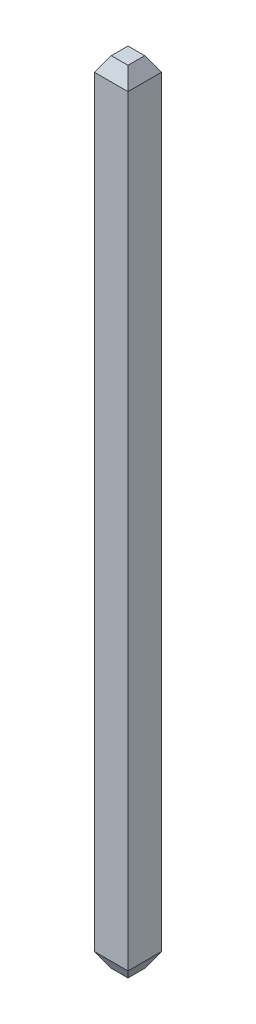
ISO-10303-21;
HEADER;
FILE_DESCRIPTION(('STEP AP214'),'2;1');
FILE_NAME('part.step','',(''),(''),'','','');
FILE_SCHEMA(('AUTOMOTIVE_DESIGN { 1 0 10303 214 1 1 1 1 }'));
ENDSEC;
DATA;
#1=APPLICATION_CONTEXT('core data for automotive mechanical design processes');
#2=APPLICATION_PROTOCOL_DEFINITION('international standard','automotive_design',2000,#1);
#3=PRODUCT_CONTEXT('',#1,'mechanical');
#4=PRODUCT('Part','Part','',(#3));
#5=PRODUCT_RELATED_PRODUCT_CATEGORY('part','',(#4));
#6=PRODUCT_DEFINITION_FORMATION('','',#4);
#7=PRODUCT_DEFINITION_CONTEXT('part definition',#1,'design');
#8=PRODUCT_DEFINITION('design','',#6,#7);
#9=PRODUCT_DEFINITION_SHAPE('','',#8);
#10=(LENGTH_UNIT() NAMED_UNIT(*) SI_UNIT(.MILLI.,.METRE.));
#11=(NAMED_UNIT(*) PLANE_ANGLE_UNIT() SI_UNIT($,.RADIAN.));
#12=(NAMED_UNIT(*) SI_UNIT($,.STERADIAN.) SOLID_ANGLE_UNIT());
#13=UNCERTAINTY_MEASURE_WITH_UNIT(LENGTH_MEASURE(1.E-05),#10,'distance_accuracy_value','');
#14=(GEOMETRIC_REPRESENTATION_CONTEXT(3) GLOBAL_UNCERTAINTY_ASSIGNED_CONTEXT((#13)) GLOBAL_UNIT_ASSIGNED_CONTEXT((#10,
#11,#12)) REPRESENTATION_CONTEXT('',''));
#15=CARTESIAN_POINT('',(0.,0.,0.));
#16=DIRECTION('',(0.,0.,1.));
#17=DIRECTION('',(1.,0.,0.));
#18=AXIS2_PLACEMENT_3D('',#15,#16,#17);
#19=CARTESIAN_POINT('',(-0.3,0.25980762113533,-0.3));
#20=DIRECTION('',(0.866025403784437,0.500000000000003,0.));
#21=DIRECTION('',(-0.500000000000003,0.866025403784437,0.));
#22=AXIS2_PLACEMENT_3D('',#19,#20,#21);
#23=PLANE('',#22);
#24=DIRECTION('',(0.,0.,-1.));
#25=VECTOR('',#24,1.);
#26=CARTESIAN_POINT('',(-0.3,0.25980762113533,-0.3));
#27=LINE('',#26,#25);
#28=CARTESIAN_POINT('',(-0.3,0.25980762113533,0.3));
#29=VERTEX_POINT('',#28);
#30=CARTESIAN_POINT('',(-0.3,0.25980762113533,-0.3));
#31=VERTEX_POINT('',#30);
#32=EDGE_CURVE('E119',#29,#31,#27,.T.);
#33=ORIENTED_EDGE('',*,*,#32,.T.);
#34=DIRECTION('',(0.44721359549996,-0.774596669241481,0.44721359549996));
#35=VECTOR('',#34,1.);
#36=CARTESIAN_POINT('',(-0.3,0.25980762113533,-0.3));
#37=LINE('',#36,#35);
#38=CARTESIAN_POINT('',(-0.15,0.,-0.15));
#39=VERTEX_POINT('',#38);
#40=EDGE_CURVE('E90',#31,#39,#37,.T.);
#41=ORIENTED_EDGE('',*,*,#40,.T.);
#42=DIRECTION('',(0.,0.,1.));
#43=VECTOR('',#42,1.);
#44=CARTESIAN_POINT('',(-0.15,0.,0.));
#45=LINE('',#44,#43);
#46=CARTESIAN_POINT('',(-0.15,0.,0.15));
#47=VERTEX_POINT('',#46);
#48=EDGE_CURVE('E20',#39,#47,#45,.T.);
#49=ORIENTED_EDGE('',*,*,#48,.T.);
#50=DIRECTION('',(-0.44721359549996,0.774596669241481,0.44721359549996));
#51=VECTOR('',#50,1.);
#52=CARTESIAN_POINT('',(-0.15,0.,0.15));
#53=LINE('',#52,#51);
#54=EDGE_CURVE('E88',#47,#29,#53,.T.);
#55=ORIENTED_EDGE('',*,*,#54,.T.);
#56=EDGE_LOOP('',(#33,#41,#49,#55));
#57=FACE_BOUND('',#56,.T.);
#58=ADVANCED_FACE('F17',(#57),#23,.F.);
#59=CARTESIAN_POINT('',(-0.15,14.2,0.));
#60=DIRECTION('',(-0.866025403784439,0.5,0.));
#61=DIRECTION('',(-0.5,-0.866025403784439,0.));
#62=AXIS2_PLACEMENT_3D('',#59,#60,#61);
#63=PLANE('',#62);
#64=DIRECTION('',(-0.447213595499958,-0.774596669241483,0.447213595499958));
#65=VECTOR('',#64,1.);
#66=CARTESIAN_POINT('',(-0.15,14.2,0.15));
#67=LINE('',#66,#65);
#68=CARTESIAN_POINT('',(-0.15,14.2,0.15));
#69=VERTEX_POINT('',#68);
#70=CARTESIAN_POINT('',(-0.3,13.9401923788647,0.3));
#71=VERTEX_POINT('',#70);
#72=EDGE_CURVE('E108',#69,#71,#67,.T.);
#73=ORIENTED_EDGE('',*,*,#72,.F.);
#74=DIRECTION('',(0.,0.,1.));
#75=VECTOR('',#74,1.);
#76=CARTESIAN_POINT('',(-0.15,14.2,0.));
#77=LINE('',#76,#75);
#78=CARTESIAN_POINT('',(-0.15,14.2,-0.15));
#79=VERTEX_POINT('',#78);
#80=EDGE_CURVE('E80',#79,#69,#77,.T.);
#81=ORIENTED_EDGE('',*,*,#80,.F.);
#82=DIRECTION('',(0.447213595499958,0.774596669241483,0.447213595499958));
#83=VECTOR('',#82,1.);
#84=CARTESIAN_POINT('',(-0.3,13.9401923788647,-0.3));
#85=LINE('',#84,#83);
#86=CARTESIAN_POINT('',(-0.3,13.9401923788647,-0.3));
#87=VERTEX_POINT('',#86);
#88=EDGE_CURVE('E115',#87,#79,#85,.T.);
#89=ORIENTED_EDGE('',*,*,#88,.F.);
#90=DIRECTION('',(0.,0.,-1.));
#91=VECTOR('',#90,1.);
#92=CARTESIAN_POINT('',(-0.3,13.9401923788647,-0.3));
#93=LINE('',#92,#91);
#94=EDGE_CURVE('E121',#87,#71,#93,.F.);
#95=ORIENTED_EDGE('',*,*,#94,.T.);
#96=EDGE_LOOP('',(#73,#81,#89,#95));
#97=FACE_BOUND('',#96,.T.);
#98=ADVANCED_FACE('F211',(#97),#63,.T.);
#99=CARTESIAN_POINT('',(0.,0.,0.));
#100=DIRECTION('',(0.,1.,0.));
#101=DIRECTION('',(0.,0.,1.));
#102=AXIS2_PLACEMENT_3D('',#99,#100,#101);
#103=PLANE('',#102);
#104=DIRECTION('',(1.,0.,0.));
#105=VECTOR('',#104,1.);
#106=CARTESIAN_POINT('',(-0.3,0.,-0.15));
#107=LINE('',#106,#105);
#108=CARTESIAN_POINT('',(0.15,0.,-0.15));
#109=VERTEX_POINT('',#108);
#110=EDGE_CURVE('E113',#39,#109,#107,.T.);
#111=ORIENTED_EDGE('',*,*,#110,.T.);
#112=DIRECTION('',(0.,0.,1.));
#113=VECTOR('',#112,1.);
#114=CARTESIAN_POINT('',(0.15,0.,-0.3));
#115=LINE('',#114,#113);
#116=CARTESIAN_POINT('',(0.15,0.,0.15));
#117=VERTEX_POINT('',#116);
#118=EDGE_CURVE('E105',#109,#117,#115,.T.);
#119=ORIENTED_EDGE('',*,*,#118,.T.);
#120=DIRECTION('',(1.,0.,0.));
#121=VECTOR('',#120,1.);
#122=CARTESIAN_POINT('',(-0.3,0.,0.15));
#123=LINE('',#122,#121);
#124=EDGE_CURVE('E94',#117,#47,#123,.F.);
#125=ORIENTED_EDGE('',*,*,#124,.T.);
#126=ORIENTED_EDGE('',*,*,#48,.F.);
#127=EDGE_LOOP('',(#111,#119,#125,#126));
#128=FACE_BOUND('',#127,.T.);
#129=ADVANCED_FACE('F103',(#128),#103,.F.);
#130=CARTESIAN_POINT('',(-0.3,0.25980762113533,0.3));
#131=DIRECTION('',(0.,0.500000000000003,-0.866025403784437));
#132=DIRECTION('',(0.,0.866025403784437,0.500000000000003));
#133=AXIS2_PLACEMENT_3D('',#130,#131,#132);
#134=PLANE('',#133);
#135=ORIENTED_EDGE('',*,*,#124,.F.);
#136=DIRECTION('',(0.44721359549996,0.774596669241481,0.44721359549996));
#137=VECTOR('',#136,1.);
#138=CARTESIAN_POINT('',(0.15,0.,0.15));
#139=LINE('',#138,#137);
#140=CARTESIAN_POINT('',(0.3,0.25980762113533,0.3));
#141=VERTEX_POINT('',#140);
#142=EDGE_CURVE('E128',#117,#141,#139,.T.);
#143=ORIENTED_EDGE('',*,*,#142,.T.);
#144=DIRECTION('',(-1.,0.,0.));
#145=VECTOR('',#144,1.);
#146=CARTESIAN_POINT('',(-0.3,0.25980762113533,0.3));
#147=LINE('',#146,#145);
#148=EDGE_CURVE('E100',#141,#29,#147,.T.);
#149=ORIENTED_EDGE('',*,*,#148,.T.);
#150=ORIENTED_EDGE('',*,*,#54,.F.);
#151=EDGE_LOOP('',(#135,#143,#149,#150));
#152=FACE_BOUND('',#151,.T.);
#153=ADVANCED_FACE('F97',(#152),#134,.F.);
#154=CARTESIAN_POINT('',(0.,14.2,0.));
#155=DIRECTION('',(0.,1.,0.));
#156=DIRECTION('',(0.,0.,1.));
#157=AXIS2_PLACEMENT_3D('',#154,#155,#156);
#158=PLANE('',#157);
#159=DIRECTION('',(0.,0.,1.));
#160=VECTOR('',#159,1.);
#161=CARTESIAN_POINT('',(0.15,14.2,0.));
#162=LINE('',#161,#160);
#163=CARTESIAN_POINT('',(0.15,14.2,-0.15));
#164=VERTEX_POINT('',#163);
#165=CARTESIAN_POINT('',(0.15,14.2,0.15));
#166=VERTEX_POINT('',#165);
#167=EDGE_CURVE('E140',#164,#166,#162,.T.);
#168=ORIENTED_EDGE('',*,*,#167,.F.);
#169=DIRECTION('',(1.,0.,0.));
#170=VECTOR('',#169,1.);
#171=CARTESIAN_POINT('',(0.,14.2,-0.15));
#172=LINE('',#171,#170);
#173=EDGE_CURVE('E117',#79,#164,#172,.T.);
#174=ORIENTED_EDGE('',*,*,#173,.F.);
#175=ORIENTED_EDGE('',*,*,#80,.T.);
#176=DIRECTION('',(1.,0.,0.));
#177=VECTOR('',#176,1.);
#178=CARTESIAN_POINT('',(0.,14.2,0.15));
#179=LINE('',#178,#177);
#180=EDGE_CURVE('E110',#166,#69,#179,.F.);
#181=ORIENTED_EDGE('',*,*,#180,.F.);
#182=EDGE_LOOP('',(#168,#174,#175,#181));
#183=FACE_BOUND('',#182,.T.);
#184=ADVANCED_FACE('F204',(#183),#158,.T.);
#185=CARTESIAN_POINT('',(0.,14.2,0.15));
#186=DIRECTION('',(0.,0.5,0.866025403784439));
#187=DIRECTION('',(0.,-0.866025403784439,0.5));
#188=AXIS2_PLACEMENT_3D('',#185,#186,#187);
#189=PLANE('',#188);
#190=DIRECTION('',(0.447213595499958,-0.774596669241483,0.447213595499958));
#191=VECTOR('',#190,1.);
#192=CARTESIAN_POINT('',(0.15,14.2,0.15));
#193=LINE('',#192,#191);
#194=CARTESIAN_POINT('',(0.3,13.9401923788647,0.3));
#195=VERTEX_POINT('',#194);
#196=EDGE_CURVE('E142',#166,#195,#193,.T.);
#197=ORIENTED_EDGE('',*,*,#196,.F.);
#198=ORIENTED_EDGE('',*,*,#180,.T.);
#199=ORIENTED_EDGE('',*,*,#72,.T.);
#200=DIRECTION('',(-1.,0.,0.));
#201=VECTOR('',#200,1.);
#202=CARTESIAN_POINT('',(-0.3,13.9401923788647,0.3));
#203=LINE('',#202,#201);
#204=EDGE_CURVE('E134',#71,#195,#203,.F.);
#205=ORIENTED_EDGE('',*,*,#204,.T.);
#206=EDGE_LOOP('',(#197,#198,#199,#205));
#207=FACE_BOUND('',#206,.T.);
#208=ADVANCED_FACE('F201',(#207),#189,.T.);
#209=CARTESIAN_POINT('',(-0.3,0.25980762113533,-0.3));
#210=DIRECTION('',(0.,0.500000000000003,0.866025403784437));
#211=DIRECTION('',(0.,-0.866025403784437,0.500000000000003));
#212=AXIS2_PLACEMENT_3D('',#209,#210,#211);
#213=PLANE('',#212);
#214=ORIENTED_EDGE('',*,*,#110,.F.);
#215=ORIENTED_EDGE('',*,*,#40,.F.);
#216=DIRECTION('',(1.,0.,0.));
#217=VECTOR('',#216,1.);
#218=CARTESIAN_POINT('',(-0.3,0.25980762113533,-0.3));
#219=LINE('',#218,#217);
#220=CARTESIAN_POINT('',(0.3,0.25980762113533,-0.3));
#221=VERTEX_POINT('',#220);
#222=EDGE_CURVE('E144',#31,#221,#219,.T.);
#223=ORIENTED_EDGE('',*,*,#222,.T.);
#224=DIRECTION('',(-0.44721359549996,-0.774596669241481,0.44721359549996));
#225=VECTOR('',#224,1.);
#226=CARTESIAN_POINT('',(0.3,0.25980762113533,-0.3));
#227=LINE('',#226,#225);
#228=EDGE_CURVE('E124',#221,#109,#227,.T.);
#229=ORIENTED_EDGE('',*,*,#228,.T.);
#230=EDGE_LOOP('',(#214,#215,#223,#229));
#231=FACE_BOUND('',#230,.T.);
#232=ADVANCED_FACE('F175',(#231),#213,.F.);
#233=CARTESIAN_POINT('',(0.,14.2,-0.15));
#234=DIRECTION('',(0.,0.5,-0.866025403784439));
#235=DIRECTION('',(0.,0.866025403784439,0.5));
#236=AXIS2_PLACEMENT_3D('',#233,#234,#235);
#237=PLANE('',#236);
#238=ORIENTED_EDGE('',*,*,#88,.T.);
#239=ORIENTED_EDGE('',*,*,#173,.T.);
#240=DIRECTION('',(-0.447213595499958,0.774596669241483,0.447213595499958));
#241=VECTOR('',#240,1.);
#242=CARTESIAN_POINT('',(0.3,13.9401923788647,-0.3));
#243=LINE('',#242,#241);
#244=CARTESIAN_POINT('',(0.3,13.9401923788647,-0.3));
#245=VERTEX_POINT('',#244);
#246=EDGE_CURVE('E137',#245,#164,#243,.T.);
#247=ORIENTED_EDGE('',*,*,#246,.F.);
#248=DIRECTION('',(1.,0.,0.));
#249=VECTOR('',#248,1.);
#250=CARTESIAN_POINT('',(-0.3,13.9401923788647,-0.3));
#251=LINE('',#250,#249);
#252=EDGE_CURVE('E34',#245,#87,#251,.F.);
#253=ORIENTED_EDGE('',*,*,#252,.T.);
#254=EDGE_LOOP('',(#238,#239,#247,#253));
#255=FACE_BOUND('',#254,.T.);
#256=ADVANCED_FACE('F194',(#255),#237,.T.);
#257=CARTESIAN_POINT('',(-0.3,14.2,-0.3));
#258=DIRECTION('',(1.,0.,0.));
#259=DIRECTION('',(0.,0.,-1.));
#260=AXIS2_PLACEMENT_3D('',#257,#258,#259);
#261=PLANE('',#260);
#262=ORIENTED_EDGE('',*,*,#94,.F.);
#263=DIRECTION('',(0.,1.,0.));
#264=VECTOR('',#263,1.);
#265=CARTESIAN_POINT('',(-0.3,14.2,-0.3));
#266=LINE('',#265,#264);
#267=EDGE_CURVE('E148',#87,#31,#266,.F.);
#268=ORIENTED_EDGE('',*,*,#267,.T.);
#269=ORIENTED_EDGE('',*,*,#32,.F.);
#270=DIRECTION('',(0.,1.,0.));
#271=VECTOR('',#270,1.);
#272=CARTESIAN_POINT('',(-0.3,14.2,0.3));
#273=LINE('',#272,#271);
#274=EDGE_CURVE('E131',#29,#71,#273,.T.);
#275=ORIENTED_EDGE('',*,*,#274,.T.);
#276=EDGE_LOOP('',(#262,#268,#269,#275));
#277=FACE_BOUND('',#276,.T.);
#278=ADVANCED_FACE('F191',(#277),#261,.F.);
#279=CARTESIAN_POINT('',(0.3,0.25980762113533,-0.3));
#280=DIRECTION('',(-0.866025403784437,0.500000000000003,0.));
#281=DIRECTION('',(-0.500000000000003,-0.866025403784437,0.));
#282=AXIS2_PLACEMENT_3D('',#279,#280,#281);
#283=PLANE('',#282);
#284=ORIENTED_EDGE('',*,*,#118,.F.);
#285=ORIENTED_EDGE('',*,*,#228,.F.);
#286=DIRECTION('',(0.,0.,1.));
#287=VECTOR('',#286,1.);
#288=CARTESIAN_POINT('',(0.3,0.25980762113533,-0.3));
#289=LINE('',#288,#287);
#290=EDGE_CURVE('E151',#221,#141,#289,.T.);
#291=ORIENTED_EDGE('',*,*,#290,.T.);
#292=ORIENTED_EDGE('',*,*,#142,.F.);
#293=EDGE_LOOP('',(#284,#285,#291,#292));
#294=FACE_BOUND('',#293,.T.);
#295=ADVANCED_FACE('F172',(#294),#283,.F.);
#296=CARTESIAN_POINT('',(-0.3,14.2,0.3));
#297=DIRECTION('',(0.,0.,-1.));
#298=DIRECTION('',(-1.,0.,0.));
#299=AXIS2_PLACEMENT_3D('',#296,#297,#298);
#300=PLANE('',#299);
#301=ORIENTED_EDGE('',*,*,#204,.F.);
#302=ORIENTED_EDGE('',*,*,#274,.F.);
#303=ORIENTED_EDGE('',*,*,#148,.F.);
#304=DIRECTION('',(0.,1.,0.));
#305=VECTOR('',#304,1.);
#306=CARTESIAN_POINT('',(0.3,14.2,0.3));
#307=LINE('',#306,#305);
#308=EDGE_CURVE('E154',#141,#195,#307,.T.);
#309=ORIENTED_EDGE('',*,*,#308,.T.);
#310=EDGE_LOOP('',(#301,#302,#303,#309));
#311=FACE_BOUND('',#310,.T.);
#312=ADVANCED_FACE('F170',(#311),#300,.F.);
#313=CARTESIAN_POINT('',(0.15,14.2,0.));
#314=DIRECTION('',(0.866025403784439,0.5,0.));
#315=DIRECTION('',(-0.5,0.866025403784439,0.));
#316=AXIS2_PLACEMENT_3D('',#313,#314,#315);
#317=PLANE('',#316);
#318=ORIENTED_EDGE('',*,*,#196,.T.);
#319=DIRECTION('',(0.,0.,1.));
#320=VECTOR('',#319,1.);
#321=CARTESIAN_POINT('',(0.3,13.9401923788647,-0.3));
#322=LINE('',#321,#320);
#323=EDGE_CURVE('E26',#195,#245,#322,.F.);
#324=ORIENTED_EDGE('',*,*,#323,.T.);
#325=ORIENTED_EDGE('',*,*,#246,.T.);
#326=ORIENTED_EDGE('',*,*,#167,.T.);
#327=EDGE_LOOP('',(#318,#324,#325,#326));
#328=FACE_BOUND('',#327,.T.);
#329=ADVANCED_FACE('F160',(#328),#317,.T.);
#330=CARTESIAN_POINT('',(-0.3,14.2,-0.3));
#331=DIRECTION('',(0.,0.,1.));
#332=DIRECTION('',(1.,0.,0.));
#333=AXIS2_PLACEMENT_3D('',#330,#331,#332);
#334=PLANE('',#333);
#335=ORIENTED_EDGE('',*,*,#252,.F.);
#336=DIRECTION('',(0.,1.,0.));
#337=VECTOR('',#336,1.);
#338=CARTESIAN_POINT('',(0.3,14.2,-0.3));
#339=LINE('',#338,#337);
#340=EDGE_CURVE('E11',#245,#221,#339,.F.);
#341=ORIENTED_EDGE('',*,*,#340,.T.);
#342=ORIENTED_EDGE('',*,*,#222,.F.);
#343=ORIENTED_EDGE('',*,*,#267,.F.);
#344=EDGE_LOOP('',(#335,#341,#342,#343));
#345=FACE_BOUND('',#344,.T.);
#346=ADVANCED_FACE('F176',(#345),#334,.F.);
#347=CARTESIAN_POINT('',(0.3,14.2,-0.3));
#348=DIRECTION('',(-1.,0.,0.));
#349=DIRECTION('',(0.,0.,1.));
#350=AXIS2_PLACEMENT_3D('',#347,#348,#349);
#351=PLANE('',#350);
#352=ORIENTED_EDGE('',*,*,#323,.F.);
#353=ORIENTED_EDGE('',*,*,#308,.F.);
#354=ORIENTED_EDGE('',*,*,#290,.F.);
#355=ORIENTED_EDGE('',*,*,#340,.F.);
#356=EDGE_LOOP('',(#352,#353,#354,#355));
#357=FACE_BOUND('',#356,.T.);
#358=ADVANCED_FACE('F166',(#357),#351,.F.);
#359=CLOSED_SHELL('',(#58,#98,#129,#153,#184,#208,#232,#256,#278,#295,#312,#329,#346,#358));
#360=MANIFOLD_SOLID_BREP('B1',#359);
#361=ADVANCED_BREP_SHAPE_REPRESENTATION('',(#18,#360),#14);
#362=SHAPE_DEFINITION_REPRESENTATION(#9,#361);
ENDSEC;
END-ISO-10303-21;
